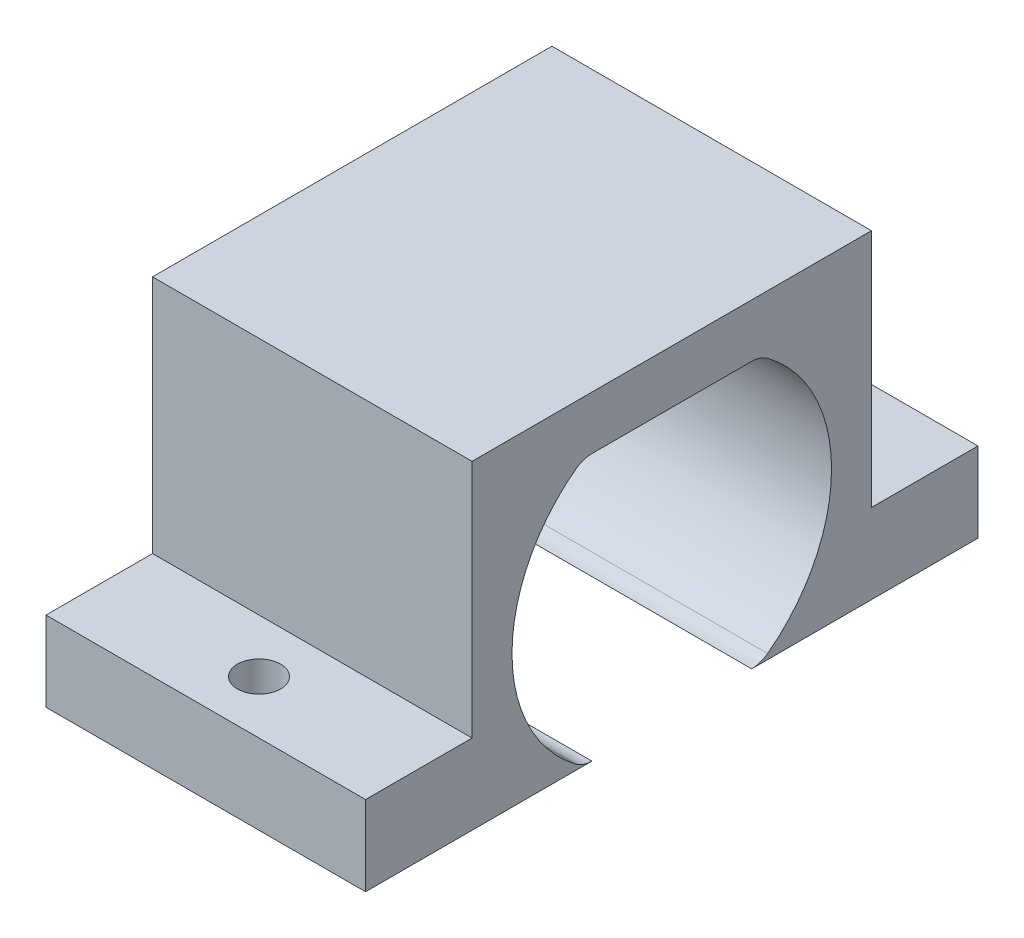
ISO-10303-21;
HEADER;
FILE_DESCRIPTION(('STEP AP214'),'2;1');
FILE_NAME('part.step','',(''),(''),'','','');
FILE_SCHEMA(('AUTOMOTIVE_DESIGN { 1 0 10303 214 1 1 1 1 }'));
ENDSEC;
DATA;
#1=APPLICATION_CONTEXT('core data for automotive mechanical design processes');
#2=APPLICATION_PROTOCOL_DEFINITION('international standard','automotive_design',2000,#1);
#3=PRODUCT_CONTEXT('',#1,'mechanical');
#4=PRODUCT('Part','Part','',(#3));
#5=PRODUCT_RELATED_PRODUCT_CATEGORY('part','',(#4));
#6=PRODUCT_DEFINITION_FORMATION('','',#4);
#7=PRODUCT_DEFINITION_CONTEXT('part definition',#1,'design');
#8=PRODUCT_DEFINITION('design','',#6,#7);
#9=PRODUCT_DEFINITION_SHAPE('','',#8);
#10=(LENGTH_UNIT() NAMED_UNIT(*) SI_UNIT(.MILLI.,.METRE.));
#11=(NAMED_UNIT(*) PLANE_ANGLE_UNIT() SI_UNIT($,.RADIAN.));
#12=(NAMED_UNIT(*) SI_UNIT($,.STERADIAN.) SOLID_ANGLE_UNIT());
#13=UNCERTAINTY_MEASURE_WITH_UNIT(LENGTH_MEASURE(1.E-05),#10,'distance_accuracy_value','');
#14=(GEOMETRIC_REPRESENTATION_CONTEXT(3) GLOBAL_UNCERTAINTY_ASSIGNED_CONTEXT((#13)) GLOBAL_UNIT_ASSIGNED_CONTEXT((#10,
#11,#12)) REPRESENTATION_CONTEXT('',''));
#15=CARTESIAN_POINT('',(0.,0.,0.));
#16=DIRECTION('',(0.,0.,1.));
#17=DIRECTION('',(1.,0.,0.));
#18=AXIS2_PLACEMENT_3D('',#15,#16,#17);
#19=CARTESIAN_POINT('',(12.,-6.,0.));
#20=DIRECTION('',(0.,-1.,0.));
#21=DIRECTION('',(0.,0.,-1.));
#22=AXIS2_PLACEMENT_3D('',#19,#20,#21);
#23=PLANE('',#22);
#24=CARTESIAN_POINT('',(6.,-6.,9.5));
#25=DIRECTION('',(0.,1.,0.));
#26=DIRECTION('',(0.,0.,-1.));
#27=AXIS2_PLACEMENT_3D('',#24,#25,#26);
#28=CIRCLE('',#27,0.81);
#29=CARTESIAN_POINT('',(6.,-6.,8.69));
#30=VERTEX_POINT('',#29);
#31=EDGE_CURVE('E307',#30,#30,#28,.T.);
#32=ORIENTED_EDGE('',*,*,#31,.T.);
#33=EDGE_LOOP('',(#32));
#34=FACE_BOUND('',#33,.T.);
#35=DIRECTION('',(0.,0.,1.));
#36=VECTOR('',#35,1.);
#37=CARTESIAN_POINT('',(0.,-6.,0.));
#38=LINE('',#37,#36);
#39=CARTESIAN_POINT('',(0.,-5.99999999999999,3.00000000000001));
#40=VERTEX_POINT('',#39);
#41=CARTESIAN_POINT('',(0.,-6.,11.5));
#42=VERTEX_POINT('',#41);
#43=EDGE_CURVE('E167',#40,#42,#38,.T.);
#44=ORIENTED_EDGE('',*,*,#43,.F.);
#45=DIRECTION('',(1.,0.,0.));
#46=VECTOR('',#45,1.);
#47=CARTESIAN_POINT('',(0.,-5.99999999999999,3.00000000000001));
#48=LINE('',#47,#46);
#49=CARTESIAN_POINT('',(12.,-5.99999999999999,3.00000000000001));
#50=VERTEX_POINT('',#49);
#51=EDGE_CURVE('E236',#40,#50,#48,.T.);
#52=ORIENTED_EDGE('',*,*,#51,.T.);
#53=DIRECTION('',(0.,0.,1.));
#54=VECTOR('',#53,1.);
#55=CARTESIAN_POINT('',(12.,-6.,0.));
#56=LINE('',#55,#54);
#57=CARTESIAN_POINT('',(12.,-6.,11.5));
#58=VERTEX_POINT('',#57);
#59=EDGE_CURVE('E113',#50,#58,#56,.T.);
#60=ORIENTED_EDGE('',*,*,#59,.T.);
#61=DIRECTION('',(-1.,0.,0.));
#62=VECTOR('',#61,1.);
#63=CARTESIAN_POINT('',(12.,-6.,11.5));
#64=LINE('',#63,#62);
#65=EDGE_CURVE('E11',#58,#42,#64,.T.);
#66=ORIENTED_EDGE('',*,*,#65,.T.);
#67=EDGE_LOOP('',(#44,#52,#60,#66));
#68=FACE_BOUND('',#67,.T.);
#69=ADVANCED_FACE('F46',(#34,#68),#23,.T.);
#70=CARTESIAN_POINT('',(12.,0.,11.5));
#71=DIRECTION('',(0.,0.,1.));
#72=DIRECTION('',(0.,-1.,0.));
#73=AXIS2_PLACEMENT_3D('',#70,#71,#72);
#74=PLANE('',#73);
#75=DIRECTION('',(0.,1.,0.));
#76=VECTOR('',#75,1.);
#77=CARTESIAN_POINT('',(0.,0.,11.5));
#78=LINE('',#77,#76);
#79=CARTESIAN_POINT('',(0.,-3.,11.5));
#80=VERTEX_POINT('',#79);
#81=EDGE_CURVE('E163',#42,#80,#78,.T.);
#82=ORIENTED_EDGE('',*,*,#81,.F.);
#83=ORIENTED_EDGE('',*,*,#65,.F.);
#84=DIRECTION('',(0.,1.,0.));
#85=VECTOR('',#84,1.);
#86=CARTESIAN_POINT('',(12.,0.,11.5));
#87=LINE('',#86,#85);
#88=CARTESIAN_POINT('',(12.,-3.,11.5));
#89=VERTEX_POINT('',#88);
#90=EDGE_CURVE('E193',#58,#89,#87,.T.);
#91=ORIENTED_EDGE('',*,*,#90,.T.);
#92=DIRECTION('',(-1.,0.,0.));
#93=VECTOR('',#92,1.);
#94=CARTESIAN_POINT('',(12.,-3.,11.5));
#95=LINE('',#94,#93);
#96=EDGE_CURVE('E105',#89,#80,#95,.T.);
#97=ORIENTED_EDGE('',*,*,#96,.T.);
#98=EDGE_LOOP('',(#82,#83,#91,#97));
#99=FACE_BOUND('',#98,.T.);
#100=ADVANCED_FACE('F48',(#99),#74,.T.);
#101=CARTESIAN_POINT('',(6.,-5.99999999999999,-9.5));
#102=DIRECTION('',(0.,1.,0.));
#103=DIRECTION('',(0.,0.,1.));
#104=AXIS2_PLACEMENT_3D('',#101,#102,#103);
#105=CIRCLE('',#104,0.81);
#106=CARTESIAN_POINT('',(6.,-5.99999999999999,-8.69));
#107=VERTEX_POINT('',#106);
#108=EDGE_CURVE('E331',#107,#107,#105,.T.);
#109=ORIENTED_EDGE('',*,*,#108,.T.);
#110=EDGE_LOOP('',(#109));
#111=FACE_BOUND('',#110,.T.);
#112=DIRECTION('',(1.,0.,0.));
#113=VECTOR('',#112,1.);
#114=CARTESIAN_POINT('',(0.,-5.99999999999998,-3.00000000000001));
#115=LINE('',#114,#113);
#116=CARTESIAN_POINT('',(0.,-5.99999999999998,-3.00000000000001));
#117=VERTEX_POINT('',#116);
#118=CARTESIAN_POINT('',(12.,-5.99999999999998,-3.00000000000001));
#119=VERTEX_POINT('',#118);
#120=EDGE_CURVE('E225',#117,#119,#115,.T.);
#121=ORIENTED_EDGE('',*,*,#120,.F.);
#122=CARTESIAN_POINT('',(0.,-6.,-11.5));
#123=VERTEX_POINT('',#122);
#124=EDGE_CURVE('E169',#123,#117,#38,.T.);
#125=ORIENTED_EDGE('',*,*,#124,.F.);
#126=DIRECTION('',(-1.,0.,0.));
#127=VECTOR('',#126,1.);
#128=CARTESIAN_POINT('',(12.,-6.,-11.5));
#129=LINE('',#128,#127);
#130=CARTESIAN_POINT('',(12.,-6.,-11.5));
#131=VERTEX_POINT('',#130);
#132=EDGE_CURVE('E55',#131,#123,#129,.T.);
#133=ORIENTED_EDGE('',*,*,#132,.F.);
#134=EDGE_CURVE('E227',#131,#119,#56,.T.);
#135=ORIENTED_EDGE('',*,*,#134,.T.);
#136=EDGE_LOOP('',(#121,#125,#133,#135));
#137=FACE_BOUND('',#136,.T.);
#138=ADVANCED_FACE('F223',(#111,#137),#23,.T.);
#139=CARTESIAN_POINT('',(12.,0.,-11.5));
#140=DIRECTION('',(0.,0.,1.));
#141=DIRECTION('',(1.,0.,0.));
#142=AXIS2_PLACEMENT_3D('',#139,#140,#141);
#143=PLANE('',#142);
#144=DIRECTION('',(0.,1.,0.));
#145=VECTOR('',#144,1.);
#146=CARTESIAN_POINT('',(0.,0.,-11.5));
#147=LINE('',#146,#145);
#148=CARTESIAN_POINT('',(0.,-3.,-11.5));
#149=VERTEX_POINT('',#148);
#150=EDGE_CURVE('E173',#123,#149,#147,.T.);
#151=ORIENTED_EDGE('',*,*,#150,.T.);
#152=DIRECTION('',(-1.,0.,0.));
#153=VECTOR('',#152,1.);
#154=CARTESIAN_POINT('',(12.,-3.,-11.5));
#155=LINE('',#154,#153);
#156=CARTESIAN_POINT('',(12.,-3.,-11.5));
#157=VERTEX_POINT('',#156);
#158=EDGE_CURVE('E203',#157,#149,#155,.T.);
#159=ORIENTED_EDGE('',*,*,#158,.F.);
#160=DIRECTION('',(0.,1.,0.));
#161=VECTOR('',#160,1.);
#162=CARTESIAN_POINT('',(12.,0.,-11.5));
#163=LINE('',#162,#161);
#164=EDGE_CURVE('E211',#131,#157,#163,.T.);
#165=ORIENTED_EDGE('',*,*,#164,.F.);
#166=ORIENTED_EDGE('',*,*,#132,.T.);
#167=EDGE_LOOP('',(#151,#159,#165,#166));
#168=FACE_BOUND('',#167,.T.);
#169=ADVANCED_FACE('F209',(#168),#143,.F.);
#170=CARTESIAN_POINT('',(12.,-3.,0.));
#171=DIRECTION('',(0.,1.,0.));
#172=DIRECTION('',(0.,0.,1.));
#173=AXIS2_PLACEMENT_3D('',#170,#171,#172);
#174=PLANE('',#173);
#175=CARTESIAN_POINT('',(6.,-2.99999999999999,-9.5));
#176=DIRECTION('',(0.,1.,0.));
#177=DIRECTION('',(0.,0.,1.));
#178=AXIS2_PLACEMENT_3D('',#175,#176,#177);
#179=CIRCLE('',#178,0.81);
#180=CARTESIAN_POINT('',(6.,-2.99999999999999,-8.69));
#181=VERTEX_POINT('',#180);
#182=EDGE_CURVE('E335',#181,#181,#179,.T.);
#183=ORIENTED_EDGE('',*,*,#182,.F.);
#184=EDGE_LOOP('',(#183));
#185=FACE_BOUND('',#184,.T.);
#186=DIRECTION('',(0.,0.,-1.));
#187=VECTOR('',#186,1.);
#188=CARTESIAN_POINT('',(0.,-3.,0.));
#189=LINE('',#188,#187);
#190=CARTESIAN_POINT('',(0.,-3.,-7.5));
#191=VERTEX_POINT('',#190);
#192=EDGE_CURVE('E177',#191,#149,#189,.T.);
#193=ORIENTED_EDGE('',*,*,#192,.F.);
#194=DIRECTION('',(-1.,0.,0.));
#195=VECTOR('',#194,1.);
#196=CARTESIAN_POINT('',(12.,-3.,-7.5));
#197=LINE('',#196,#195);
#198=CARTESIAN_POINT('',(12.,-3.,-7.5));
#199=VERTEX_POINT('',#198);
#200=EDGE_CURVE('E200',#199,#191,#197,.T.);
#201=ORIENTED_EDGE('',*,*,#200,.F.);
#202=DIRECTION('',(0.,0.,-1.));
#203=VECTOR('',#202,1.);
#204=CARTESIAN_POINT('',(12.,-3.,0.));
#205=LINE('',#204,#203);
#206=EDGE_CURVE('E267',#199,#157,#205,.T.);
#207=ORIENTED_EDGE('',*,*,#206,.T.);
#208=ORIENTED_EDGE('',*,*,#158,.T.);
#209=EDGE_LOOP('',(#193,#201,#207,#208));
#210=FACE_BOUND('',#209,.T.);
#211=ADVANCED_FACE('F427',(#185,#210),#174,.T.);
#212=CARTESIAN_POINT('',(12.,0.,-7.5));
#213=DIRECTION('',(0.,0.,1.));
#214=DIRECTION('',(1.,0.,0.));
#215=AXIS2_PLACEMENT_3D('',#212,#213,#214);
#216=PLANE('',#215);
#217=DIRECTION('',(0.,1.,0.));
#218=VECTOR('',#217,1.);
#219=CARTESIAN_POINT('',(0.,0.,-7.5));
#220=LINE('',#219,#218);
#221=CARTESIAN_POINT('',(0.,6.,-7.5));
#222=VERTEX_POINT('',#221);
#223=EDGE_CURVE('E181',#191,#222,#220,.T.);
#224=ORIENTED_EDGE('',*,*,#223,.T.);
#225=DIRECTION('',(-1.,0.,0.));
#226=VECTOR('',#225,1.);
#227=CARTESIAN_POINT('',(12.,6.,-7.5));
#228=LINE('',#227,#226);
#229=CARTESIAN_POINT('',(12.,6.,-7.5));
#230=VERTEX_POINT('',#229);
#231=EDGE_CURVE('E144',#230,#222,#228,.T.);
#232=ORIENTED_EDGE('',*,*,#231,.F.);
#233=DIRECTION('',(0.,1.,0.));
#234=VECTOR('',#233,1.);
#235=CARTESIAN_POINT('',(12.,0.,-7.5));
#236=LINE('',#235,#234);
#237=EDGE_CURVE('E152',#199,#230,#236,.T.);
#238=ORIENTED_EDGE('',*,*,#237,.F.);
#239=ORIENTED_EDGE('',*,*,#200,.T.);
#240=EDGE_LOOP('',(#224,#232,#238,#239));
#241=FACE_BOUND('',#240,.T.);
#242=ADVANCED_FACE('F436',(#241),#216,.F.);
#243=CARTESIAN_POINT('',(12.,6.,0.));
#244=DIRECTION('',(0.,1.,0.));
#245=DIRECTION('',(0.,0.,1.));
#246=AXIS2_PLACEMENT_3D('',#243,#244,#245);
#247=PLANE('',#246);
#248=DIRECTION('',(0.,0.,-1.));
#249=VECTOR('',#248,1.);
#250=CARTESIAN_POINT('',(0.,6.,0.));
#251=LINE('',#250,#249);
#252=CARTESIAN_POINT('',(0.,6.,7.5));
#253=VERTEX_POINT('',#252);
#254=EDGE_CURVE('E138',#253,#222,#251,.T.);
#255=ORIENTED_EDGE('',*,*,#254,.F.);
#256=DIRECTION('',(-1.,0.,0.));
#257=VECTOR('',#256,1.);
#258=CARTESIAN_POINT('',(12.,6.,7.5));
#259=LINE('',#258,#257);
#260=CARTESIAN_POINT('',(12.,6.,7.5));
#261=VERTEX_POINT('',#260);
#262=EDGE_CURVE('E133',#261,#253,#259,.T.);
#263=ORIENTED_EDGE('',*,*,#262,.F.);
#264=DIRECTION('',(0.,0.,-1.));
#265=VECTOR('',#264,1.);
#266=CARTESIAN_POINT('',(12.,6.,0.));
#267=LINE('',#266,#265);
#268=EDGE_CURVE('E136',#261,#230,#267,.T.);
#269=ORIENTED_EDGE('',*,*,#268,.T.);
#270=ORIENTED_EDGE('',*,*,#231,.T.);
#271=EDGE_LOOP('',(#255,#263,#269,#270));
#272=FACE_BOUND('',#271,.T.);
#273=ADVANCED_FACE('F135',(#272),#247,.T.);
#274=CARTESIAN_POINT('',(12.,0.,7.5));
#275=DIRECTION('',(0.,0.,1.));
#276=DIRECTION('',(1.,0.,0.));
#277=AXIS2_PLACEMENT_3D('',#274,#275,#276);
#278=PLANE('',#277);
#279=DIRECTION('',(0.,1.,0.));
#280=VECTOR('',#279,1.);
#281=CARTESIAN_POINT('',(0.,0.,7.5));
#282=LINE('',#281,#280);
#283=CARTESIAN_POINT('',(0.,-3.,7.5));
#284=VERTEX_POINT('',#283);
#285=EDGE_CURVE('E187',#284,#253,#282,.T.);
#286=ORIENTED_EDGE('',*,*,#285,.F.);
#287=DIRECTION('',(-1.,0.,0.));
#288=VECTOR('',#287,1.);
#289=CARTESIAN_POINT('',(12.,-3.,7.5));
#290=LINE('',#289,#288);
#291=CARTESIAN_POINT('',(12.,-3.,7.5));
#292=VERTEX_POINT('',#291);
#293=EDGE_CURVE('E145',#292,#284,#290,.T.);
#294=ORIENTED_EDGE('',*,*,#293,.F.);
#295=DIRECTION('',(0.,1.,0.));
#296=VECTOR('',#295,1.);
#297=CARTESIAN_POINT('',(12.,0.,7.5));
#298=LINE('',#297,#296);
#299=EDGE_CURVE('E149',#292,#261,#298,.T.);
#300=ORIENTED_EDGE('',*,*,#299,.T.);
#301=ORIENTED_EDGE('',*,*,#262,.T.);
#302=EDGE_LOOP('',(#286,#294,#300,#301));
#303=FACE_BOUND('',#302,.T.);
#304=ADVANCED_FACE('F156',(#303),#278,.T.);
#305=CARTESIAN_POINT('',(12.,-3.,0.));
#306=DIRECTION('',(0.,-1.,0.));
#307=DIRECTION('',(0.,0.,-1.));
#308=AXIS2_PLACEMENT_3D('',#305,#306,#307);
#309=PLANE('',#308);
#310=CARTESIAN_POINT('',(6.,-3.,9.5));
#311=DIRECTION('',(0.,1.,0.));
#312=DIRECTION('',(0.,0.,-1.));
#313=AXIS2_PLACEMENT_3D('',#310,#311,#312);
#314=CIRCLE('',#313,0.81);
#315=CARTESIAN_POINT('',(6.,-3.,8.69));
#316=VERTEX_POINT('',#315);
#317=EDGE_CURVE('E339',#316,#316,#314,.T.);
#318=ORIENTED_EDGE('',*,*,#317,.F.);
#319=EDGE_LOOP('',(#318));
#320=FACE_BOUND('',#319,.T.);
#321=DIRECTION('',(0.,0.,1.));
#322=VECTOR('',#321,1.);
#323=CARTESIAN_POINT('',(0.,-3.,0.));
#324=LINE('',#323,#322);
#325=EDGE_CURVE('E190',#284,#80,#324,.T.);
#326=ORIENTED_EDGE('',*,*,#325,.T.);
#327=ORIENTED_EDGE('',*,*,#96,.F.);
#328=DIRECTION('',(0.,0.,1.));
#329=VECTOR('',#328,1.);
#330=CARTESIAN_POINT('',(12.,-3.,0.));
#331=LINE('',#330,#329);
#332=EDGE_CURVE('E71',#292,#89,#331,.T.);
#333=ORIENTED_EDGE('',*,*,#332,.F.);
#334=ORIENTED_EDGE('',*,*,#293,.T.);
#335=EDGE_LOOP('',(#326,#327,#333,#334));
#336=FACE_BOUND('',#335,.T.);
#337=ADVANCED_FACE('F356',(#320,#336),#309,.F.);
#338=CARTESIAN_POINT('',(12.,0.,0.));
#339=DIRECTION('',(1.,0.,0.));
#340=DIRECTION('',(0.,0.,-1.));
#341=AXIS2_PLACEMENT_3D('',#338,#339,#340);
#342=PLANE('',#341);
#343=CARTESIAN_POINT('',(12.,-4.99999999999998,-3.));
#344=DIRECTION('',(1.,0.,0.));
#345=DIRECTION('',(0.,0.,-1.));
#346=AXIS2_PLACEMENT_3D('',#343,#344,#345);
#347=CIRCLE('',#346,0.999999999999998);
#348=CARTESIAN_POINT('',(12.,-5.7999999996493,-3.60000000046757));
#349=VERTEX_POINT('',#348);
#350=EDGE_CURVE('E285',#119,#349,#347,.T.);
#351=ORIENTED_EDGE('',*,*,#350,.F.);
#352=ORIENTED_EDGE('',*,*,#134,.F.);
#353=ORIENTED_EDGE('',*,*,#164,.T.);
#354=ORIENTED_EDGE('',*,*,#206,.F.);
#355=ORIENTED_EDGE('',*,*,#237,.T.);
#356=ORIENTED_EDGE('',*,*,#268,.F.);
#357=ORIENTED_EDGE('',*,*,#299,.F.);
#358=ORIENTED_EDGE('',*,*,#332,.T.);
#359=ORIENTED_EDGE('',*,*,#90,.F.);
#360=ORIENTED_EDGE('',*,*,#59,.F.);
#361=CARTESIAN_POINT('',(12.,-4.99999999999999,2.99999999999997));
#362=DIRECTION('',(1.,0.,0.));
#363=DIRECTION('',(0.,0.,1.));
#364=AXIS2_PLACEMENT_3D('',#361,#362,#363);
#365=CIRCLE('',#364,0.999999999999992);
#366=CARTESIAN_POINT('',(12.,-5.79999999964932,3.60000000046754));
#367=VERTEX_POINT('',#366);
#368=EDGE_CURVE('E288',#367,#50,#365,.T.);
#369=ORIENTED_EDGE('',*,*,#368,.F.);
#370=CARTESIAN_POINT('',(12.,-1.00000000042379,0.));
#371=DIRECTION('',(1.,0.,0.));
#372=DIRECTION('',(0.,0.,1.));
#373=AXIS2_PLACEMENT_3D('',#370,#371,#372);
#374=CIRCLE('',#373,5.99999999966095);
#375=CARTESIAN_POINT('',(12.,3.79999999940169,3.59999999966761));
#376=VERTEX_POINT('',#375);
#377=EDGE_CURVE('E292',#376,#367,#374,.T.);
#378=ORIENTED_EDGE('',*,*,#377,.F.);
#379=CARTESIAN_POINT('',(12.,2.99999999972883,2.99999999979662));
#380=DIRECTION('',(1.,0.,0.));
#381=DIRECTION('',(0.,0.,1.));
#382=AXIS2_PLACEMENT_3D('',#379,#380,#381);
#383=CIRCLE('',#382,0.999999999660882);
#384=CARTESIAN_POINT('',(12.,3.99999999938971,2.99999999979688));
#385=VERTEX_POINT('',#384);
#386=EDGE_CURVE('E296',#385,#376,#383,.T.);
#387=ORIENTED_EDGE('',*,*,#386,.F.);
#388=DIRECTION('',(0.,0.,1.));
#389=VECTOR('',#388,1.);
#390=CARTESIAN_POINT('',(12.,3.99999999938972,-2.99999999979688));
#391=LINE('',#390,#389);
#392=CARTESIAN_POINT('',(12.,3.99999999938972,-2.99999999979688));
#393=VERTEX_POINT('',#392);
#394=EDGE_CURVE('E300',#393,#385,#391,.T.);
#395=ORIENTED_EDGE('',*,*,#394,.F.);
#396=CARTESIAN_POINT('',(12.,2.99999999972884,-2.99999999979662));
#397=DIRECTION('',(1.,0.,0.));
#398=DIRECTION('',(0.,0.,-1.));
#399=AXIS2_PLACEMENT_3D('',#396,#397,#398);
#400=CIRCLE('',#399,0.999999999660882);
#401=CARTESIAN_POINT('',(12.,3.79999999940171,-3.5999999996676));
#402=VERTEX_POINT('',#401);
#403=EDGE_CURVE('E304',#402,#393,#400,.T.);
#404=ORIENTED_EDGE('',*,*,#403,.F.);
#405=CARTESIAN_POINT('',(12.,-1.00000000042379,0.));
#406=DIRECTION('',(1.,0.,0.));
#407=DIRECTION('',(0.,0.,-1.));
#408=AXIS2_PLACEMENT_3D('',#405,#406,#407);
#409=CIRCLE('',#408,5.99999999966095);
#410=EDGE_CURVE('E281',#349,#402,#409,.T.);
#411=ORIENTED_EDGE('',*,*,#410,.F.);
#412=EDGE_LOOP('',(#351,#352,#353,#354,#355,#356,#357,#358,#359,#360,#369,#378,#387,#395,#404,#411));
#413=FACE_BOUND('',#412,.T.);
#414=ADVANCED_FACE('F148',(#413),#342,.T.);
#415=CARTESIAN_POINT('',(0.,0.,0.));
#416=DIRECTION('',(1.,0.,0.));
#417=DIRECTION('',(0.,0.,-1.));
#418=AXIS2_PLACEMENT_3D('',#415,#416,#417);
#419=PLANE('',#418);
#420=ORIENTED_EDGE('',*,*,#124,.T.);
#421=CARTESIAN_POINT('',(0.,-4.99999999999998,-3.));
#422=DIRECTION('',(1.,0.,0.));
#423=DIRECTION('',(0.,0.,-1.));
#424=AXIS2_PLACEMENT_3D('',#421,#422,#423);
#425=CIRCLE('',#424,0.999999999999998);
#426=CARTESIAN_POINT('',(0.,-5.7999999996493,-3.60000000046757));
#427=VERTEX_POINT('',#426);
#428=EDGE_CURVE('E311',#117,#427,#425,.T.);
#429=ORIENTED_EDGE('',*,*,#428,.T.);
#430=CARTESIAN_POINT('',(0.,-1.00000000042379,0.));
#431=DIRECTION('',(1.,0.,0.));
#432=DIRECTION('',(0.,0.,-1.));
#433=AXIS2_PLACEMENT_3D('',#430,#431,#432);
#434=CIRCLE('',#433,5.99999999966095);
#435=CARTESIAN_POINT('',(0.,3.79999999940171,-3.5999999996676));
#436=VERTEX_POINT('',#435);
#437=EDGE_CURVE('E260',#427,#436,#434,.T.);
#438=ORIENTED_EDGE('',*,*,#437,.T.);
#439=CARTESIAN_POINT('',(0.,2.99999999972884,-2.99999999979662));
#440=DIRECTION('',(1.,0.,0.));
#441=DIRECTION('',(0.,0.,-1.));
#442=AXIS2_PLACEMENT_3D('',#439,#440,#441);
#443=CIRCLE('',#442,0.999999999660882);
#444=CARTESIAN_POINT('',(0.,3.99999999938972,-2.99999999979688));
#445=VERTEX_POINT('',#444);
#446=EDGE_CURVE('E284',#436,#445,#443,.T.);
#447=ORIENTED_EDGE('',*,*,#446,.T.);
#448=DIRECTION('',(0.,0.,1.));
#449=VECTOR('',#448,1.);
#450=CARTESIAN_POINT('',(0.,3.99999999938972,-2.99999999979688));
#451=LINE('',#450,#449);
#452=CARTESIAN_POINT('',(0.,3.99999999938971,2.99999999979688));
#453=VERTEX_POINT('',#452);
#454=EDGE_CURVE('E324',#445,#453,#451,.T.);
#455=ORIENTED_EDGE('',*,*,#454,.T.);
#456=CARTESIAN_POINT('',(0.,2.99999999972883,2.99999999979662));
#457=DIRECTION('',(1.,0.,0.));
#458=DIRECTION('',(0.,0.,1.));
#459=AXIS2_PLACEMENT_3D('',#456,#457,#458);
#460=CIRCLE('',#459,0.999999999660882);
#461=CARTESIAN_POINT('',(0.,3.79999999940169,3.59999999966761));
#462=VERTEX_POINT('',#461);
#463=EDGE_CURVE('E62',#453,#462,#460,.T.);
#464=ORIENTED_EDGE('',*,*,#463,.T.);
#465=CARTESIAN_POINT('',(0.,-1.00000000042379,0.));
#466=DIRECTION('',(1.,0.,0.));
#467=DIRECTION('',(0.,0.,1.));
#468=AXIS2_PLACEMENT_3D('',#465,#466,#467);
#469=CIRCLE('',#468,5.99999999966095);
#470=CARTESIAN_POINT('',(0.,-5.79999999964932,3.60000000046754));
#471=VERTEX_POINT('',#470);
#472=EDGE_CURVE('E318',#462,#471,#469,.T.);
#473=ORIENTED_EDGE('',*,*,#472,.T.);
#474=CARTESIAN_POINT('',(0.,-4.99999999999999,2.99999999999997));
#475=DIRECTION('',(1.,0.,0.));
#476=DIRECTION('',(0.,0.,1.));
#477=AXIS2_PLACEMENT_3D('',#474,#475,#476);
#478=CIRCLE('',#477,0.999999999999992);
#479=EDGE_CURVE('E314',#471,#40,#478,.T.);
#480=ORIENTED_EDGE('',*,*,#479,.T.);
#481=ORIENTED_EDGE('',*,*,#43,.T.);
#482=ORIENTED_EDGE('',*,*,#81,.T.);
#483=ORIENTED_EDGE('',*,*,#325,.F.);
#484=ORIENTED_EDGE('',*,*,#285,.T.);
#485=ORIENTED_EDGE('',*,*,#254,.T.);
#486=ORIENTED_EDGE('',*,*,#223,.F.);
#487=ORIENTED_EDGE('',*,*,#192,.T.);
#488=ORIENTED_EDGE('',*,*,#150,.F.);
#489=EDGE_LOOP('',(#420,#429,#438,#447,#455,#464,#473,#480,#481,#482,#483,#484,#485,#486,#487,#488));
#490=FACE_BOUND('',#489,.T.);
#491=ADVANCED_FACE('F217',(#490),#419,.F.);
#492=CARTESIAN_POINT('',(0.,2.99999999972884,-2.99999999979662));
#493=DIRECTION('',(1.,0.,0.));
#494=DIRECTION('',(0.,0.,-1.));
#495=AXIS2_PLACEMENT_3D('',#492,#493,#494);
#496=CYLINDRICAL_SURFACE('',#495,0.999999999660882);
#497=ORIENTED_EDGE('',*,*,#403,.T.);
#498=DIRECTION('',(1.,0.,0.));
#499=VECTOR('',#498,1.);
#500=CARTESIAN_POINT('',(0.,3.99999999938972,-2.99999999979688));
#501=LINE('',#500,#499);
#502=EDGE_CURVE('E256',#445,#393,#501,.T.);
#503=ORIENTED_EDGE('',*,*,#502,.F.);
#504=ORIENTED_EDGE('',*,*,#446,.F.);
#505=DIRECTION('',(1.,0.,0.));
#506=VECTOR('',#505,1.);
#507=CARTESIAN_POINT('',(0.,3.79999999940171,-3.5999999996676));
#508=LINE('',#507,#506);
#509=EDGE_CURVE('E168',#436,#402,#508,.T.);
#510=ORIENTED_EDGE('',*,*,#509,.T.);
#511=EDGE_LOOP('',(#497,#503,#504,#510));
#512=FACE_BOUND('',#511,.T.);
#513=ADVANCED_FACE('F402',(#512),#496,.F.);
#514=CARTESIAN_POINT('',(0.,-1.00000000042379,0.));
#515=DIRECTION('',(1.,0.,0.));
#516=DIRECTION('',(0.,0.,-1.));
#517=AXIS2_PLACEMENT_3D('',#514,#515,#516);
#518=CYLINDRICAL_SURFACE('',#517,5.99999999966095);
#519=ORIENTED_EDGE('',*,*,#410,.T.);
#520=ORIENTED_EDGE('',*,*,#509,.F.);
#521=ORIENTED_EDGE('',*,*,#437,.F.);
#522=DIRECTION('',(1.,0.,0.));
#523=VECTOR('',#522,1.);
#524=CARTESIAN_POINT('',(0.,-5.7999999996493,-3.60000000046757));
#525=LINE('',#524,#523);
#526=EDGE_CURVE('E235',#427,#349,#525,.T.);
#527=ORIENTED_EDGE('',*,*,#526,.T.);
#528=EDGE_LOOP('',(#519,#520,#521,#527));
#529=FACE_BOUND('',#528,.T.);
#530=ADVANCED_FACE('F404',(#529),#518,.F.);
#531=CARTESIAN_POINT('',(0.,-4.99999999999998,-3.));
#532=DIRECTION('',(1.,0.,0.));
#533=DIRECTION('',(0.,0.,-1.));
#534=AXIS2_PLACEMENT_3D('',#531,#532,#533);
#535=CYLINDRICAL_SURFACE('',#534,0.999999999999998);
#536=ORIENTED_EDGE('',*,*,#350,.T.);
#537=ORIENTED_EDGE('',*,*,#526,.F.);
#538=ORIENTED_EDGE('',*,*,#428,.F.);
#539=ORIENTED_EDGE('',*,*,#120,.T.);
#540=EDGE_LOOP('',(#536,#537,#538,#539));
#541=FACE_BOUND('',#540,.T.);
#542=ADVANCED_FACE('F410',(#541),#535,.F.);
#543=CARTESIAN_POINT('',(0.,-4.99999999999999,2.99999999999997));
#544=DIRECTION('',(1.,0.,0.));
#545=DIRECTION('',(0.,0.,-1.));
#546=AXIS2_PLACEMENT_3D('',#543,#544,#545);
#547=CYLINDRICAL_SURFACE('',#546,0.999999999999992);
#548=ORIENTED_EDGE('',*,*,#368,.T.);
#549=ORIENTED_EDGE('',*,*,#51,.F.);
#550=ORIENTED_EDGE('',*,*,#479,.F.);
#551=DIRECTION('',(1.,0.,0.));
#552=VECTOR('',#551,1.);
#553=CARTESIAN_POINT('',(0.,-5.79999999964932,3.60000000046754));
#554=LINE('',#553,#552);
#555=EDGE_CURVE('E242',#471,#367,#554,.T.);
#556=ORIENTED_EDGE('',*,*,#555,.T.);
#557=EDGE_LOOP('',(#548,#549,#550,#556));
#558=FACE_BOUND('',#557,.T.);
#559=ADVANCED_FACE('F439',(#558),#547,.F.);
#560=CARTESIAN_POINT('',(0.,-1.00000000042379,0.));
#561=DIRECTION('',(1.,0.,0.));
#562=DIRECTION('',(0.,0.,-1.));
#563=AXIS2_PLACEMENT_3D('',#560,#561,#562);
#564=CYLINDRICAL_SURFACE('',#563,5.99999999966095);
#565=ORIENTED_EDGE('',*,*,#377,.T.);
#566=ORIENTED_EDGE('',*,*,#555,.F.);
#567=ORIENTED_EDGE('',*,*,#472,.F.);
#568=DIRECTION('',(1.,0.,0.));
#569=VECTOR('',#568,1.);
#570=CARTESIAN_POINT('',(0.,3.79999999940169,3.59999999966761));
#571=LINE('',#570,#569);
#572=EDGE_CURVE('E249',#462,#376,#571,.T.);
#573=ORIENTED_EDGE('',*,*,#572,.T.);
#574=EDGE_LOOP('',(#565,#566,#567,#573));
#575=FACE_BOUND('',#574,.T.);
#576=ADVANCED_FACE('F395',(#575),#564,.F.);
#577=CARTESIAN_POINT('',(0.,2.99999999972883,2.99999999979662));
#578=DIRECTION('',(1.,0.,0.));
#579=DIRECTION('',(0.,0.,-1.));
#580=AXIS2_PLACEMENT_3D('',#577,#578,#579);
#581=CYLINDRICAL_SURFACE('',#580,0.999999999660882);
#582=ORIENTED_EDGE('',*,*,#386,.T.);
#583=ORIENTED_EDGE('',*,*,#572,.F.);
#584=ORIENTED_EDGE('',*,*,#463,.F.);
#585=DIRECTION('',(1.,0.,0.));
#586=VECTOR('',#585,1.);
#587=CARTESIAN_POINT('',(0.,3.99999999938971,2.99999999979688));
#588=LINE('',#587,#586);
#589=EDGE_CURVE('E253',#453,#385,#588,.T.);
#590=ORIENTED_EDGE('',*,*,#589,.T.);
#591=EDGE_LOOP('',(#582,#583,#584,#590));
#592=FACE_BOUND('',#591,.T.);
#593=ADVANCED_FACE('F397',(#592),#581,.F.);
#594=CARTESIAN_POINT('',(0.,3.99999999938972,-2.99999999979688));
#595=DIRECTION('',(0.,1.,0.));
#596=DIRECTION('',(0.,0.,1.));
#597=AXIS2_PLACEMENT_3D('',#594,#595,#596);
#598=PLANE('',#597);
#599=ORIENTED_EDGE('',*,*,#394,.T.);
#600=ORIENTED_EDGE('',*,*,#589,.F.);
#601=ORIENTED_EDGE('',*,*,#454,.F.);
#602=ORIENTED_EDGE('',*,*,#502,.T.);
#603=EDGE_LOOP('',(#599,#600,#601,#602));
#604=FACE_BOUND('',#603,.T.);
#605=ADVANCED_FACE('F352',(#604),#598,.F.);
#606=CARTESIAN_POINT('',(6.,-6.,9.5));
#607=DIRECTION('',(0.,1.,0.));
#608=DIRECTION('',(0.,0.,1.));
#609=AXIS2_PLACEMENT_3D('',#606,#607,#608);
#610=CYLINDRICAL_SURFACE('',#609,0.81);
#611=ORIENTED_EDGE('',*,*,#31,.F.);
#612=EDGE_LOOP('',(#611));
#613=FACE_BOUND('',#612,.T.);
#614=ORIENTED_EDGE('',*,*,#317,.T.);
#615=EDGE_LOOP('',(#614));
#616=FACE_BOUND('',#615,.T.);
#617=ADVANCED_FACE('F348',(#613,#616),#610,.F.);
#618=CARTESIAN_POINT('',(6.,-5.99999999999999,-9.5));
#619=DIRECTION('',(0.,1.,0.));
#620=DIRECTION('',(0.,0.,1.));
#621=AXIS2_PLACEMENT_3D('',#618,#619,#620);
#622=CYLINDRICAL_SURFACE('',#621,0.81);
#623=ORIENTED_EDGE('',*,*,#108,.F.);
#624=EDGE_LOOP('',(#623));
#625=FACE_BOUND('',#624,.T.);
#626=ORIENTED_EDGE('',*,*,#182,.T.);
#627=EDGE_LOOP('',(#626));
#628=FACE_BOUND('',#627,.T.);
#629=ADVANCED_FACE('F351',(#625,#628),#622,.F.);
#630=CLOSED_SHELL('',(#69,#100,#138,#169,#211,#242,#273,#304,#337,#414,#491,#513,#530,#542,#559,
#576,#593,#605,#617,#629));
#631=MANIFOLD_SOLID_BREP('B2',#630);
#632=ADVANCED_BREP_SHAPE_REPRESENTATION('',(#18,#631),#14);
#633=SHAPE_DEFINITION_REPRESENTATION(#9,#632);
ENDSEC;
END-ISO-10303-21;
